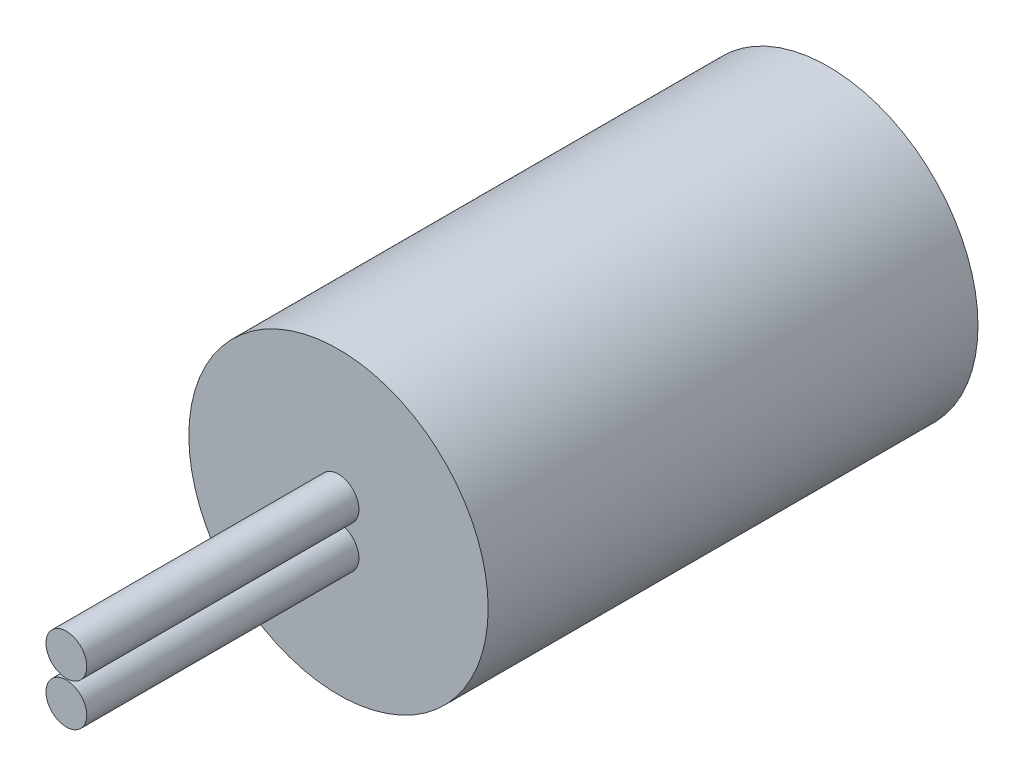
ISO-10303-21;
HEADER;
FILE_DESCRIPTION(('STEP AP214'),'2;1');
FILE_NAME('part.step','',(''),(''),'','','');
FILE_SCHEMA(('AUTOMOTIVE_DESIGN { 1 0 10303 214 1 1 1 1 }'));
ENDSEC;
DATA;
#1=APPLICATION_CONTEXT('core data for automotive mechanical design processes');
#2=APPLICATION_PROTOCOL_DEFINITION('international standard','automotive_design',2000,#1);
#3=PRODUCT_CONTEXT('',#1,'mechanical');
#4=PRODUCT('Part','Part','',(#3));
#5=PRODUCT_RELATED_PRODUCT_CATEGORY('part','',(#4));
#6=PRODUCT_DEFINITION_FORMATION('','',#4);
#7=PRODUCT_DEFINITION_CONTEXT('part definition',#1,'design');
#8=PRODUCT_DEFINITION('design','',#6,#7);
#9=PRODUCT_DEFINITION_SHAPE('','',#8);
#10=(LENGTH_UNIT() NAMED_UNIT(*) SI_UNIT(.MILLI.,.METRE.));
#11=(NAMED_UNIT(*) PLANE_ANGLE_UNIT() SI_UNIT($,.RADIAN.));
#12=(NAMED_UNIT(*) SI_UNIT($,.STERADIAN.) SOLID_ANGLE_UNIT());
#13=UNCERTAINTY_MEASURE_WITH_UNIT(LENGTH_MEASURE(1.E-05),#10,'distance_accuracy_value','');
#14=(GEOMETRIC_REPRESENTATION_CONTEXT(3) GLOBAL_UNCERTAINTY_ASSIGNED_CONTEXT((#13)) GLOBAL_UNIT_ASSIGNED_CONTEXT((#10,
#11,#12)) REPRESENTATION_CONTEXT('',''));
#15=CARTESIAN_POINT('',(0.,0.,0.));
#16=DIRECTION('',(0.,0.,1.));
#17=DIRECTION('',(1.,0.,0.));
#18=AXIS2_PLACEMENT_3D('',#15,#16,#17);
#19=CARTESIAN_POINT('',(0.,0.,9.));
#20=DIRECTION('',(0.,0.,-1.));
#21=DIRECTION('',(-1.,0.,0.));
#22=AXIS2_PLACEMENT_3D('',#19,#20,#21);
#23=CYLINDRICAL_SURFACE('',#22,5.5);
#24=CARTESIAN_POINT('',(0.,0.,9.));
#25=DIRECTION('',(0.,0.,1.));
#26=DIRECTION('',(1.,0.,0.));
#27=AXIS2_PLACEMENT_3D('',#24,#25,#26);
#28=CIRCLE('',#27,5.5);
#29=CARTESIAN_POINT('',(5.5,0.,9.));
#30=VERTEX_POINT('',#29);
#31=EDGE_CURVE('E10',#30,#30,#28,.T.);
#32=ORIENTED_EDGE('',*,*,#31,.F.);
#33=EDGE_LOOP('',(#32));
#34=FACE_BOUND('',#33,.T.);
#35=CARTESIAN_POINT('',(0.,0.,-9.));
#36=DIRECTION('',(0.,0.,1.));
#37=DIRECTION('',(1.,0.,0.));
#38=AXIS2_PLACEMENT_3D('',#35,#36,#37);
#39=CIRCLE('',#38,5.5);
#40=CARTESIAN_POINT('',(5.5,0.,-9.));
#41=VERTEX_POINT('',#40);
#42=EDGE_CURVE('E35',#41,#41,#39,.T.);
#43=ORIENTED_EDGE('',*,*,#42,.T.);
#44=EDGE_LOOP('',(#43));
#45=FACE_BOUND('',#44,.T.);
#46=ADVANCED_FACE('F32',(#34,#45),#23,.T.);
#47=CARTESIAN_POINT('',(0.,0.,9.));
#48=DIRECTION('',(0.,0.,1.));
#49=DIRECTION('',(1.,0.,0.));
#50=AXIS2_PLACEMENT_3D('',#47,#48,#49);
#51=PLANE('',#50);
#52=CARTESIAN_POINT('',(0.,0.775,9.));
#53=DIRECTION('',(0.,0.,1.));
#54=DIRECTION('',(1.,0.,0.));
#55=AXIS2_PLACEMENT_3D('',#52,#53,#54);
#56=CIRCLE('',#55,0.75);
#57=CARTESIAN_POINT('',(0.75,0.775,9.));
#58=VERTEX_POINT('',#57);
#59=EDGE_CURVE('E50',#58,#58,#56,.T.);
#60=ORIENTED_EDGE('',*,*,#59,.F.);
#61=EDGE_LOOP('',(#60));
#62=FACE_BOUND('',#61,.T.);
#63=CARTESIAN_POINT('',(0.,-0.775,9.));
#64=DIRECTION('',(0.,0.,1.));
#65=DIRECTION('',(1.,0.,0.));
#66=AXIS2_PLACEMENT_3D('',#63,#64,#65);
#67=CIRCLE('',#66,0.75);
#68=CARTESIAN_POINT('',(0.75,-0.775,9.));
#69=VERTEX_POINT('',#68);
#70=EDGE_CURVE('E44',#69,#69,#67,.T.);
#71=ORIENTED_EDGE('',*,*,#70,.F.);
#72=EDGE_LOOP('',(#71));
#73=FACE_BOUND('',#72,.T.);
#74=ORIENTED_EDGE('',*,*,#31,.T.);
#75=EDGE_LOOP('',(#74));
#76=FACE_BOUND('',#75,.T.);
#77=ADVANCED_FACE('F65',(#62,#73,#76),#51,.T.);
#78=CARTESIAN_POINT('',(0.,0.,-9.));
#79=DIRECTION('',(0.,0.,1.));
#80=DIRECTION('',(1.,0.,0.));
#81=AXIS2_PLACEMENT_3D('',#78,#79,#80);
#82=PLANE('',#81);
#83=ORIENTED_EDGE('',*,*,#42,.F.);
#84=EDGE_LOOP('',(#83));
#85=FACE_BOUND('',#84,.T.);
#86=ADVANCED_FACE('F68',(#85),#82,.F.);
#87=CARTESIAN_POINT('',(0.,-0.775,19.));
#88=DIRECTION('',(0.,0.,-1.));
#89=DIRECTION('',(-1.,0.,0.));
#90=AXIS2_PLACEMENT_3D('',#87,#88,#89);
#91=CYLINDRICAL_SURFACE('',#90,0.75);
#92=CARTESIAN_POINT('',(0.,-0.775,19.));
#93=DIRECTION('',(0.,0.,1.));
#94=DIRECTION('',(1.,0.,0.));
#95=AXIS2_PLACEMENT_3D('',#92,#93,#94);
#96=CIRCLE('',#95,0.75);
#97=CARTESIAN_POINT('',(0.75,-0.775,19.));
#98=VERTEX_POINT('',#97);
#99=EDGE_CURVE('E42',#98,#98,#96,.T.);
#100=ORIENTED_EDGE('',*,*,#99,.F.);
#101=EDGE_LOOP('',(#100));
#102=FACE_BOUND('',#101,.T.);
#103=ORIENTED_EDGE('',*,*,#70,.T.);
#104=EDGE_LOOP('',(#103));
#105=FACE_BOUND('',#104,.T.);
#106=ADVANCED_FACE('F72',(#102,#105),#91,.T.);
#107=CARTESIAN_POINT('',(0.,-0.775,19.));
#108=DIRECTION('',(0.,0.,1.));
#109=DIRECTION('',(1.,0.,0.));
#110=AXIS2_PLACEMENT_3D('',#107,#108,#109);
#111=PLANE('',#110);
#112=ORIENTED_EDGE('',*,*,#99,.T.);
#113=EDGE_LOOP('',(#112));
#114=FACE_BOUND('',#113,.T.);
#115=ADVANCED_FACE('F61',(#114),#111,.T.);
#116=CARTESIAN_POINT('',(0.,0.775,19.));
#117=DIRECTION('',(0.,0.,-1.));
#118=DIRECTION('',(-1.,0.,0.));
#119=AXIS2_PLACEMENT_3D('',#116,#117,#118);
#120=CYLINDRICAL_SURFACE('',#119,0.75);
#121=CARTESIAN_POINT('',(0.,0.775,19.));
#122=DIRECTION('',(0.,0.,1.));
#123=DIRECTION('',(1.,0.,0.));
#124=AXIS2_PLACEMENT_3D('',#121,#122,#123);
#125=CIRCLE('',#124,0.75);
#126=CARTESIAN_POINT('',(0.75,0.775,19.));
#127=VERTEX_POINT('',#126);
#128=EDGE_CURVE('E47',#127,#127,#125,.T.);
#129=ORIENTED_EDGE('',*,*,#128,.F.);
#130=EDGE_LOOP('',(#129));
#131=FACE_BOUND('',#130,.T.);
#132=ORIENTED_EDGE('',*,*,#59,.T.);
#133=EDGE_LOOP('',(#132));
#134=FACE_BOUND('',#133,.T.);
#135=ADVANCED_FACE('F58',(#131,#134),#120,.T.);
#136=CARTESIAN_POINT('',(0.,0.775,19.));
#137=DIRECTION('',(0.,0.,1.));
#138=DIRECTION('',(1.,0.,0.));
#139=AXIS2_PLACEMENT_3D('',#136,#137,#138);
#140=PLANE('',#139);
#141=ORIENTED_EDGE('',*,*,#128,.T.);
#142=EDGE_LOOP('',(#141));
#143=FACE_BOUND('',#142,.T.);
#144=ADVANCED_FACE('F56',(#143),#140,.T.);
#145=CLOSED_SHELL('',(#46,#77,#86,#106,#115,#135,#144));
#146=MANIFOLD_SOLID_BREP('B2',#145);
#147=ADVANCED_BREP_SHAPE_REPRESENTATION('',(#18,#146),#14);
#148=SHAPE_DEFINITION_REPRESENTATION(#9,#147);
ENDSEC;
END-ISO-10303-21;
